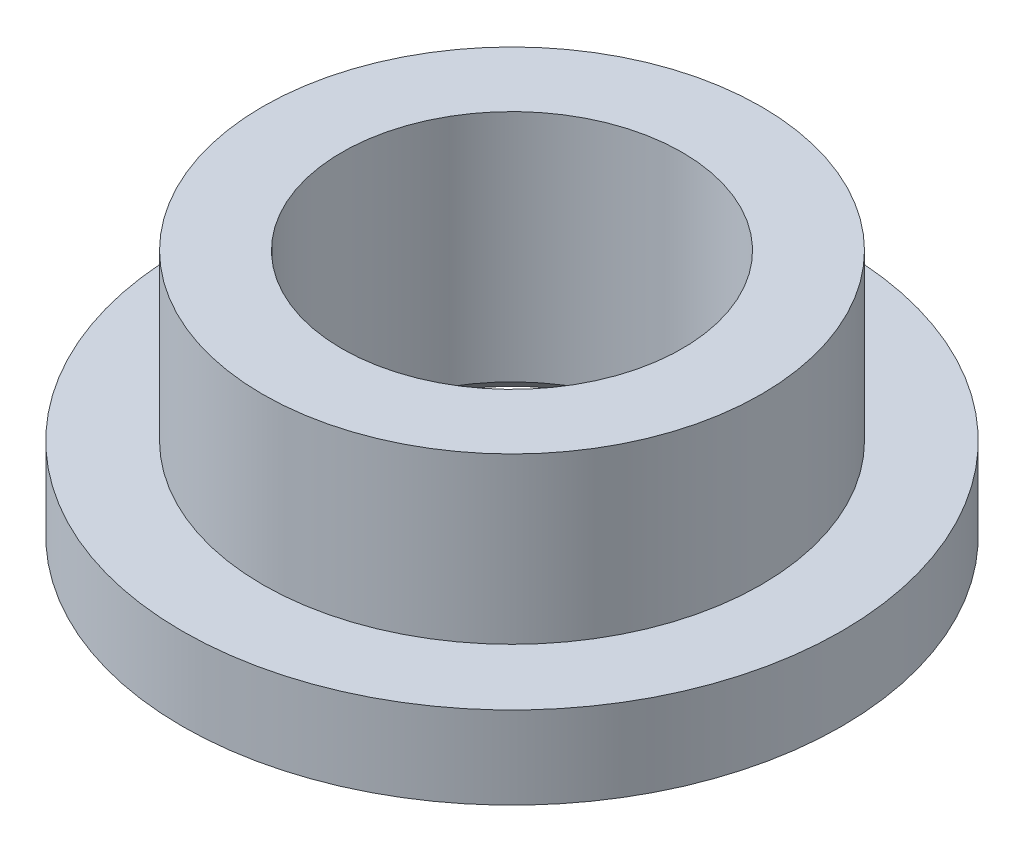
ISO-10303-21;
HEADER;
FILE_DESCRIPTION(('STEP AP214'),'2;1');
FILE_NAME('part.step','',(''),(''),'','','');
FILE_SCHEMA(('AUTOMOTIVE_DESIGN { 1 0 10303 214 1 1 1 1 }'));
ENDSEC;
DATA;
#1=APPLICATION_CONTEXT('core data for automotive mechanical design processes');
#2=APPLICATION_PROTOCOL_DEFINITION('international standard','automotive_design',2000,#1);
#3=PRODUCT_CONTEXT('',#1,'mechanical');
#4=PRODUCT('Part','Part','',(#3));
#5=PRODUCT_RELATED_PRODUCT_CATEGORY('part','',(#4));
#6=PRODUCT_DEFINITION_FORMATION('','',#4);
#7=PRODUCT_DEFINITION_CONTEXT('part definition',#1,'design');
#8=PRODUCT_DEFINITION('design','',#6,#7);
#9=PRODUCT_DEFINITION_SHAPE('','',#8);
#10=(LENGTH_UNIT() NAMED_UNIT(*) SI_UNIT(.MILLI.,.METRE.));
#11=(NAMED_UNIT(*) PLANE_ANGLE_UNIT() SI_UNIT($,.RADIAN.));
#12=(NAMED_UNIT(*) SI_UNIT($,.STERADIAN.) SOLID_ANGLE_UNIT());
#13=UNCERTAINTY_MEASURE_WITH_UNIT(LENGTH_MEASURE(1.E-05),#10,'distance_accuracy_value','');
#14=(GEOMETRIC_REPRESENTATION_CONTEXT(3) GLOBAL_UNCERTAINTY_ASSIGNED_CONTEXT((#13)) GLOBAL_UNIT_ASSIGNED_CONTEXT((#10,
#11,#12)) REPRESENTATION_CONTEXT('',''));
#15=CARTESIAN_POINT('',(0.,0.,0.));
#16=DIRECTION('',(0.,0.,1.));
#17=DIRECTION('',(1.,0.,0.));
#18=AXIS2_PLACEMENT_3D('',#15,#16,#17);
#19=CARTESIAN_POINT('',(0.,3.175,0.));
#20=DIRECTION('',(0.,-1.,0.));
#21=DIRECTION('',(0.,0.,-1.));
#22=AXIS2_PLACEMENT_3D('',#19,#20,#21);
#23=CYLINDRICAL_SURFACE('',#22,4.8006);
#24=CARTESIAN_POINT('',(0.,3.175,0.));
#25=DIRECTION('',(0.,1.,0.));
#26=DIRECTION('',(0.,0.,1.));
#27=AXIS2_PLACEMENT_3D('',#24,#25,#26);
#28=CIRCLE('',#27,4.8006);
#29=CARTESIAN_POINT('',(0.,3.175,4.8006));
#30=VERTEX_POINT('',#29);
#31=EDGE_CURVE('E51',#30,#30,#28,.T.);
#32=ORIENTED_EDGE('',*,*,#31,.F.);
#33=EDGE_LOOP('',(#32));
#34=FACE_BOUND('',#33,.T.);
#35=CARTESIAN_POINT('',(0.,0.,0.));
#36=DIRECTION('',(0.,1.,0.));
#37=DIRECTION('',(0.,0.,1.));
#38=AXIS2_PLACEMENT_3D('',#35,#36,#37);
#39=CIRCLE('',#38,4.8006);
#40=CARTESIAN_POINT('',(0.,0.,4.8006));
#41=VERTEX_POINT('',#40);
#42=EDGE_CURVE('E55',#41,#41,#39,.T.);
#43=ORIENTED_EDGE('',*,*,#42,.T.);
#44=EDGE_LOOP('',(#43));
#45=FACE_BOUND('',#44,.T.);
#46=ADVANCED_FACE('F39',(#34,#45),#23,.T.);
#47=CARTESIAN_POINT('',(0.,3.175,0.));
#48=DIRECTION('',(0.,1.,0.));
#49=DIRECTION('',(0.,0.,1.));
#50=AXIS2_PLACEMENT_3D('',#47,#48,#49);
#51=PLANE('',#50);
#52=CARTESIAN_POINT('',(0.,3.175,0.));
#53=DIRECTION('',(0.,1.,0.));
#54=DIRECTION('',(0.,0.,1.));
#55=AXIS2_PLACEMENT_3D('',#52,#53,#54);
#56=CIRCLE('',#55,3.2766);
#57=CARTESIAN_POINT('',(0.,3.175,3.2766));
#58=VERTEX_POINT('',#57);
#59=EDGE_CURVE('E64',#58,#58,#56,.T.);
#60=ORIENTED_EDGE('',*,*,#59,.F.);
#61=EDGE_LOOP('',(#60));
#62=FACE_BOUND('',#61,.T.);
#63=ORIENTED_EDGE('',*,*,#31,.T.);
#64=EDGE_LOOP('',(#63));
#65=FACE_BOUND('',#64,.T.);
#66=ADVANCED_FACE('F72',(#62,#65),#51,.T.);
#67=CARTESIAN_POINT('',(0.,-1.5875,0.));
#68=DIRECTION('',(0.,1.,0.));
#69=DIRECTION('',(0.,0.,1.));
#70=AXIS2_PLACEMENT_3D('',#67,#68,#69);
#71=CYLINDRICAL_SURFACE('',#70,6.35);
#72=CARTESIAN_POINT('',(0.,-1.5875,0.));
#73=DIRECTION('',(0.,-1.,0.));
#74=DIRECTION('',(0.,0.,-1.));
#75=AXIS2_PLACEMENT_3D('',#72,#73,#74);
#76=CIRCLE('',#75,6.35);
#77=CARTESIAN_POINT('',(0.,-1.5875,-6.35));
#78=VERTEX_POINT('',#77);
#79=EDGE_CURVE('E59',#78,#78,#76,.T.);
#80=ORIENTED_EDGE('',*,*,#79,.F.);
#81=EDGE_LOOP('',(#80));
#82=FACE_BOUND('',#81,.T.);
#83=CARTESIAN_POINT('',(0.,0.,0.));
#84=DIRECTION('',(0.,-1.,0.));
#85=DIRECTION('',(0.,0.,-1.));
#86=AXIS2_PLACEMENT_3D('',#83,#84,#85);
#87=CIRCLE('',#86,6.35);
#88=CARTESIAN_POINT('',(0.,0.,-6.35));
#89=VERTEX_POINT('',#88);
#90=EDGE_CURVE('E61',#89,#89,#87,.T.);
#91=ORIENTED_EDGE('',*,*,#90,.T.);
#92=EDGE_LOOP('',(#91));
#93=FACE_BOUND('',#92,.T.);
#94=ADVANCED_FACE('F75',(#82,#93),#71,.T.);
#95=CARTESIAN_POINT('',(0.,-1.5875,0.));
#96=DIRECTION('',(0.,-1.,0.));
#97=DIRECTION('',(0.,0.,-1.));
#98=AXIS2_PLACEMENT_3D('',#95,#96,#97);
#99=PLANE('',#98);
#100=CARTESIAN_POINT('',(0.,-1.5875,0.));
#101=DIRECTION('',(0.,-1.,0.));
#102=DIRECTION('',(0.,0.,-1.));
#103=AXIS2_PLACEMENT_3D('',#100,#101,#102);
#104=CIRCLE('',#103,3.5306);
#105=CARTESIAN_POINT('',(0.,-1.5875,-3.5306));
#106=VERTEX_POINT('',#105);
#107=EDGE_CURVE('E47',#106,#106,#104,.F.);
#108=ORIENTED_EDGE('',*,*,#107,.T.);
#109=EDGE_LOOP('',(#108));
#110=FACE_BOUND('',#109,.T.);
#111=ORIENTED_EDGE('',*,*,#79,.T.);
#112=EDGE_LOOP('',(#111));
#113=FACE_BOUND('',#112,.T.);
#114=ADVANCED_FACE('F86',(#110,#113),#99,.T.);
#115=CARTESIAN_POINT('',(0.,0.,0.));
#116=DIRECTION('',(0.,-1.,0.));
#117=DIRECTION('',(0.,0.,-1.));
#118=AXIS2_PLACEMENT_3D('',#115,#116,#117);
#119=PLANE('',#118);
#120=ORIENTED_EDGE('',*,*,#42,.F.);
#121=EDGE_LOOP('',(#120));
#122=FACE_BOUND('',#121,.T.);
#123=ORIENTED_EDGE('',*,*,#90,.F.);
#124=EDGE_LOOP('',(#123));
#125=FACE_BOUND('',#124,.T.);
#126=ADVANCED_FACE('F83',(#122,#125),#119,.F.);
#127=CARTESIAN_POINT('',(0.,-1.5875,0.));
#128=DIRECTION('',(0.,1.,0.));
#129=DIRECTION('',(0.,0.,1.));
#130=AXIS2_PLACEMENT_3D('',#127,#128,#129);
#131=CYLINDRICAL_SURFACE('',#130,3.2766);
#132=CARTESIAN_POINT('',(0.,-1.3335,0.));
#133=DIRECTION('',(0.,-1.,0.));
#134=DIRECTION('',(0.,0.,-1.));
#135=AXIS2_PLACEMENT_3D('',#132,#133,#134);
#136=CIRCLE('',#135,3.2766);
#137=CARTESIAN_POINT('',(0.,-1.3335,-3.2766));
#138=VERTEX_POINT('',#137);
#139=EDGE_CURVE('E10',#138,#138,#136,.T.);
#140=ORIENTED_EDGE('',*,*,#139,.T.);
#141=EDGE_LOOP('',(#140));
#142=FACE_BOUND('',#141,.T.);
#143=ORIENTED_EDGE('',*,*,#59,.T.);
#144=EDGE_LOOP('',(#143));
#145=FACE_BOUND('',#144,.T.);
#146=ADVANCED_FACE('F70',(#142,#145),#131,.F.);
#147=CARTESIAN_POINT('',(0.,-1.5875,0.));
#148=DIRECTION('',(0.,-1.,0.));
#149=DIRECTION('',(0.,0.,-1.));
#150=AXIS2_PLACEMENT_3D('',#147,#148,#149);
#151=CONICAL_SURFACE('',#150,3.5306,0.78539816339745);
#152=ORIENTED_EDGE('',*,*,#139,.F.);
#153=EDGE_LOOP('',(#152));
#154=FACE_BOUND('',#153,.T.);
#155=ORIENTED_EDGE('',*,*,#107,.F.);
#156=EDGE_LOOP('',(#155));
#157=FACE_BOUND('',#156,.T.);
#158=ADVANCED_FACE('F42',(#154,#157),#151,.F.);
#159=CLOSED_SHELL('',(#46,#66,#94,#114,#126,#146,#158));
#160=MANIFOLD_SOLID_BREP('B2',#159);
#161=ADVANCED_BREP_SHAPE_REPRESENTATION('',(#18,#160),#14);
#162=SHAPE_DEFINITION_REPRESENTATION(#9,#161);
ENDSEC;
END-ISO-10303-21;
